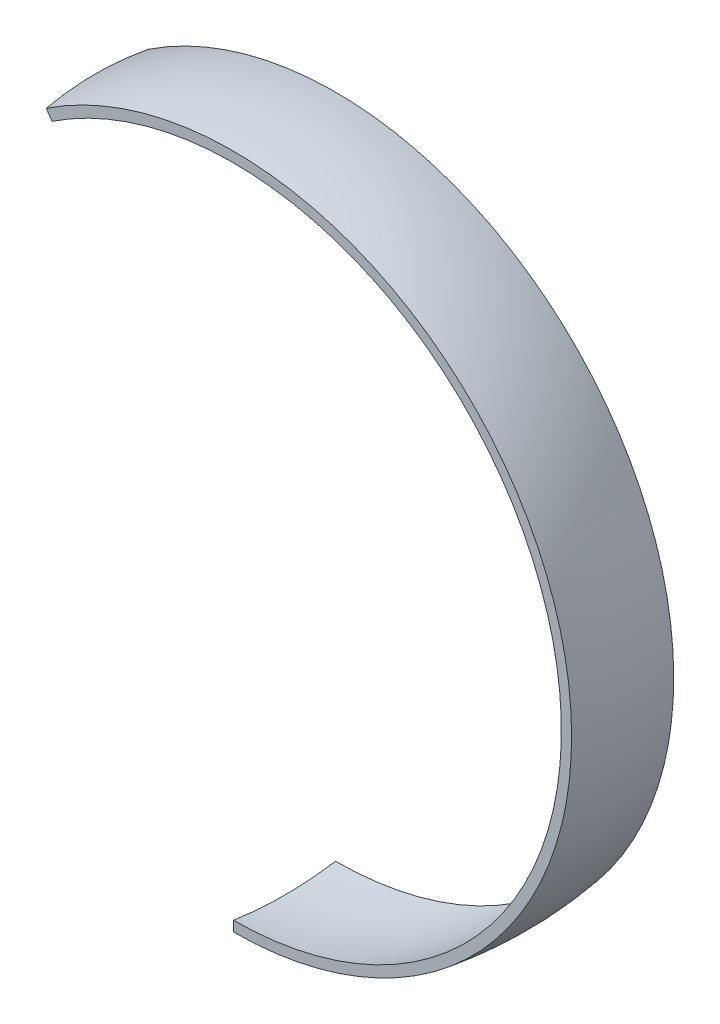
ISO-10303-21;
HEADER;
FILE_DESCRIPTION(('STEP AP214'),'2;1');
FILE_NAME('part.step','',(''),(''),'','','');
FILE_SCHEMA(('AUTOMOTIVE_DESIGN { 1 0 10303 214 1 1 1 1 }'));
ENDSEC;
DATA;
#1=APPLICATION_CONTEXT('core data for automotive mechanical design processes');
#2=APPLICATION_PROTOCOL_DEFINITION('international standard','automotive_design',2000,#1);
#3=PRODUCT_CONTEXT('',#1,'mechanical');
#4=PRODUCT('Part','Part','',(#3));
#5=PRODUCT_RELATED_PRODUCT_CATEGORY('part','',(#4));
#6=PRODUCT_DEFINITION_FORMATION('','',#4);
#7=PRODUCT_DEFINITION_CONTEXT('part definition',#1,'design');
#8=PRODUCT_DEFINITION('design','',#6,#7);
#9=PRODUCT_DEFINITION_SHAPE('','',#8);
#10=(LENGTH_UNIT() NAMED_UNIT(*) SI_UNIT(.MILLI.,.METRE.));
#11=(NAMED_UNIT(*) PLANE_ANGLE_UNIT() SI_UNIT($,.RADIAN.));
#12=(NAMED_UNIT(*) SI_UNIT($,.STERADIAN.) SOLID_ANGLE_UNIT());
#13=UNCERTAINTY_MEASURE_WITH_UNIT(LENGTH_MEASURE(1.E-05),#10,'distance_accuracy_value','');
#14=(GEOMETRIC_REPRESENTATION_CONTEXT(3) GLOBAL_UNCERTAINTY_ASSIGNED_CONTEXT((#13)) GLOBAL_UNIT_ASSIGNED_CONTEXT((#10,
#11,#12)) REPRESENTATION_CONTEXT('',''));
#15=CARTESIAN_POINT('',(0.,0.,0.));
#16=DIRECTION('',(0.,0.,1.));
#17=DIRECTION('',(1.,0.,0.));
#18=AXIS2_PLACEMENT_3D('',#15,#16,#17);
#19=CARTESIAN_POINT('',(0.,0.,0.));
#20=DIRECTION('',(1.,0.,0.));
#21=DIRECTION('',(0.,0.,-1.));
#22=AXIS2_PLACEMENT_3D('',#19,#20,#21);
#23=PLANE('',#22);
#24=CARTESIAN_POINT('',(0.,0.,0.));
#25=DIRECTION('',(1.,0.,0.));
#26=DIRECTION('',(0.,0.,-1.));
#27=AXIS2_PLACEMENT_3D('',#24,#25,#26);
#28=CIRCLE('',#27,170.121316859735);
#29=CARTESIAN_POINT('',(0.,-168.214453749047,25.4));
#30=VERTEX_POINT('',#29);
#31=CARTESIAN_POINT('',(0.,-168.214453749047,-25.4));
#32=VERTEX_POINT('',#31);
#33=EDGE_CURVE('E90',#30,#32,#28,.T.);
#34=ORIENTED_EDGE('',*,*,#33,.F.);
#35=DIRECTION('',(0.,-1.,0.));
#36=VECTOR('',#35,1.);
#37=CARTESIAN_POINT('',(0.,-168.214453749047,25.4));
#38=LINE('',#37,#36);
#39=CARTESIAN_POINT('',(0.,-163.134453749047,25.4));
#40=VERTEX_POINT('',#39);
#41=EDGE_CURVE('E76',#40,#30,#38,.T.);
#42=ORIENTED_EDGE('',*,*,#41,.F.);
#43=CARTESIAN_POINT('',(0.,0.,0.));
#44=DIRECTION('',(-1.,0.,0.));
#45=DIRECTION('',(0.,0.,-1.));
#46=AXIS2_PLACEMENT_3D('',#43,#44,#45);
#47=CIRCLE('',#46,165.1);
#48=CARTESIAN_POINT('',(0.,-163.134453749047,-25.4));
#49=VERTEX_POINT('',#48);
#50=EDGE_CURVE('E83',#49,#40,#47,.T.);
#51=ORIENTED_EDGE('',*,*,#50,.F.);
#52=DIRECTION('',(0.,1.,0.));
#53=VECTOR('',#52,1.);
#54=CARTESIAN_POINT('',(0.,-168.214453749047,-25.4));
#55=LINE('',#54,#53);
#56=EDGE_CURVE('E87',#32,#49,#55,.T.);
#57=ORIENTED_EDGE('',*,*,#56,.F.);
#58=EDGE_LOOP('',(#34,#42,#51,#57));
#59=FACE_BOUND('',#58,.T.);
#60=ADVANCED_FACE('F41',(#59),#23,.F.);
#61=CARTESIAN_POINT('',(0.,0.,0.));
#62=DIRECTION('',(-0.832921240710103,-0.553391549243339,0.));
#63=DIRECTION('',(0.,0.,-1.));
#64=AXIS2_PLACEMENT_3D('',#61,#62,#63);
#65=PLANE('',#64);
#66=CARTESIAN_POINT('',(0.,0.,0.));
#67=DIRECTION('',(-0.832921240710103,-0.553391549243339,0.));
#68=DIRECTION('',(0.,0.,-1.));
#69=AXIS2_PLACEMENT_3D('',#66,#67,#68);
#70=CIRCLE('',#69,170.121316859735);
#71=CARTESIAN_POINT('',(-93.0884571653072,140.109391522029,25.4));
#72=VERTEX_POINT('',#71);
#73=CARTESIAN_POINT('',(-93.0884571653072,140.109391522029,-25.4));
#74=VERTEX_POINT('',#73);
#75=EDGE_CURVE('E106',#72,#74,#70,.T.);
#76=ORIENTED_EDGE('',*,*,#75,.T.);
#77=DIRECTION('',(0.553391549243339,-0.832921240710103,0.));
#78=VECTOR('',#77,1.);
#79=CARTESIAN_POINT('',(-93.0884571653072,140.109391522029,-25.4));
#80=LINE('',#79,#78);
#81=CARTESIAN_POINT('',(-90.277228095151,135.878151619221,-25.4));
#82=VERTEX_POINT('',#81);
#83=EDGE_CURVE('E64',#74,#82,#80,.T.);
#84=ORIENTED_EDGE('',*,*,#83,.T.);
#85=CARTESIAN_POINT('',(0.,0.,0.));
#86=DIRECTION('',(0.832921240710103,0.553391549243339,0.));
#87=DIRECTION('',(0.,0.,-1.));
#88=AXIS2_PLACEMENT_3D('',#85,#86,#87);
#89=CIRCLE('',#88,165.1);
#90=CARTESIAN_POINT('',(-90.277228095151,135.878151619221,25.4));
#91=VERTEX_POINT('',#90);
#92=EDGE_CURVE('E58',#82,#91,#89,.T.);
#93=ORIENTED_EDGE('',*,*,#92,.T.);
#94=DIRECTION('',(-0.553391549243339,0.832921240710103,0.));
#95=VECTOR('',#94,1.);
#96=CARTESIAN_POINT('',(-93.0884571653072,140.109391522029,25.4));
#97=LINE('',#96,#95);
#98=EDGE_CURVE('E11',#91,#72,#97,.T.);
#99=ORIENTED_EDGE('',*,*,#98,.T.);
#100=EDGE_LOOP('',(#76,#84,#93,#99));
#101=FACE_BOUND('',#100,.T.);
#102=ADVANCED_FACE('F139',(#101),#65,.T.);
#103=CARTESIAN_POINT('',(0.,0.,0.));
#104=DIRECTION('',(0.,0.,1.));
#105=DIRECTION('',(0.,-1.,0.));
#106=AXIS2_PLACEMENT_3D('',#103,#104,#105);
#107=SPHERICAL_SURFACE('',#106,170.121316859735);
#108=CARTESIAN_POINT('',(0.,0.,-25.4));
#109=DIRECTION('',(0.,0.,1.));
#110=DIRECTION('',(0.,-1.,0.));
#111=AXIS2_PLACEMENT_3D('',#108,#109,#110);
#112=CIRCLE('',#111,168.214453749047);
#113=EDGE_CURVE('E112',#32,#74,#112,.T.);
#114=ORIENTED_EDGE('',*,*,#113,.T.);
#115=ORIENTED_EDGE('',*,*,#75,.F.);
#116=CARTESIAN_POINT('',(0.,0.,25.4));
#117=DIRECTION('',(0.,0.,1.));
#118=DIRECTION('',(0.,-1.,0.));
#119=AXIS2_PLACEMENT_3D('',#116,#117,#118);
#120=CIRCLE('',#119,168.214453749047);
#121=EDGE_CURVE('E101',#30,#72,#120,.T.);
#122=ORIENTED_EDGE('',*,*,#121,.F.);
#123=ORIENTED_EDGE('',*,*,#33,.T.);
#124=EDGE_LOOP('',(#114,#115,#122,#123));
#125=FACE_BOUND('',#124,.T.);
#126=ADVANCED_FACE('F105',(#125),#107,.T.);
#127=CARTESIAN_POINT('',(0.,-168.214453749047,-25.4));
#128=DIRECTION('',(0.,0.,-1.));
#129=DIRECTION('',(-1.,0.,0.));
#130=AXIS2_PLACEMENT_3D('',#127,#128,#129);
#131=PLANE('',#130);
#132=CARTESIAN_POINT('',(0.,0.,-25.4));
#133=DIRECTION('',(0.,0.,1.));
#134=DIRECTION('',(0.,-1.,0.));
#135=AXIS2_PLACEMENT_3D('',#132,#133,#134);
#136=CIRCLE('',#135,163.134453749047);
#137=EDGE_CURVE('E119',#49,#82,#136,.T.);
#138=ORIENTED_EDGE('',*,*,#137,.T.);
#139=ORIENTED_EDGE('',*,*,#83,.F.);
#140=ORIENTED_EDGE('',*,*,#113,.F.);
#141=ORIENTED_EDGE('',*,*,#56,.T.);
#142=EDGE_LOOP('',(#138,#139,#140,#141));
#143=FACE_BOUND('',#142,.T.);
#144=ADVANCED_FACE('F131',(#143),#131,.T.);
#145=CARTESIAN_POINT('',(0.,0.,0.));
#146=DIRECTION('',(0.,0.,1.));
#147=DIRECTION('',(0.,-1.,0.));
#148=AXIS2_PLACEMENT_3D('',#145,#146,#147);
#149=SPHERICAL_SURFACE('',#148,165.1);
#150=CARTESIAN_POINT('',(0.,0.,25.4));
#151=DIRECTION('',(0.,0.,1.));
#152=DIRECTION('',(0.,-1.,0.));
#153=AXIS2_PLACEMENT_3D('',#150,#151,#152);
#154=CIRCLE('',#153,163.134453749047);
#155=EDGE_CURVE('E49',#40,#91,#154,.T.);
#156=ORIENTED_EDGE('',*,*,#155,.T.);
#157=ORIENTED_EDGE('',*,*,#92,.F.);
#158=ORIENTED_EDGE('',*,*,#137,.F.);
#159=ORIENTED_EDGE('',*,*,#50,.T.);
#160=EDGE_LOOP('',(#156,#157,#158,#159));
#161=FACE_BOUND('',#160,.T.);
#162=ADVANCED_FACE('F128',(#161),#149,.F.);
#163=CARTESIAN_POINT('',(0.,-168.214453749047,25.4));
#164=DIRECTION('',(0.,0.,1.));
#165=DIRECTION('',(1.,0.,0.));
#166=AXIS2_PLACEMENT_3D('',#163,#164,#165);
#167=PLANE('',#166);
#168=ORIENTED_EDGE('',*,*,#98,.F.);
#169=ORIENTED_EDGE('',*,*,#155,.F.);
#170=ORIENTED_EDGE('',*,*,#41,.T.);
#171=ORIENTED_EDGE('',*,*,#121,.T.);
#172=EDGE_LOOP('',(#168,#169,#170,#171));
#173=FACE_BOUND('',#172,.T.);
#174=ADVANCED_FACE('F100',(#173),#167,.T.);
#175=CLOSED_SHELL('',(#60,#102,#126,#144,#162,#174));
#176=MANIFOLD_SOLID_BREP('B2',#175);
#177=ADVANCED_BREP_SHAPE_REPRESENTATION('',(#18,#176),#14);
#178=SHAPE_DEFINITION_REPRESENTATION(#9,#177);
ENDSEC;
END-ISO-10303-21;
